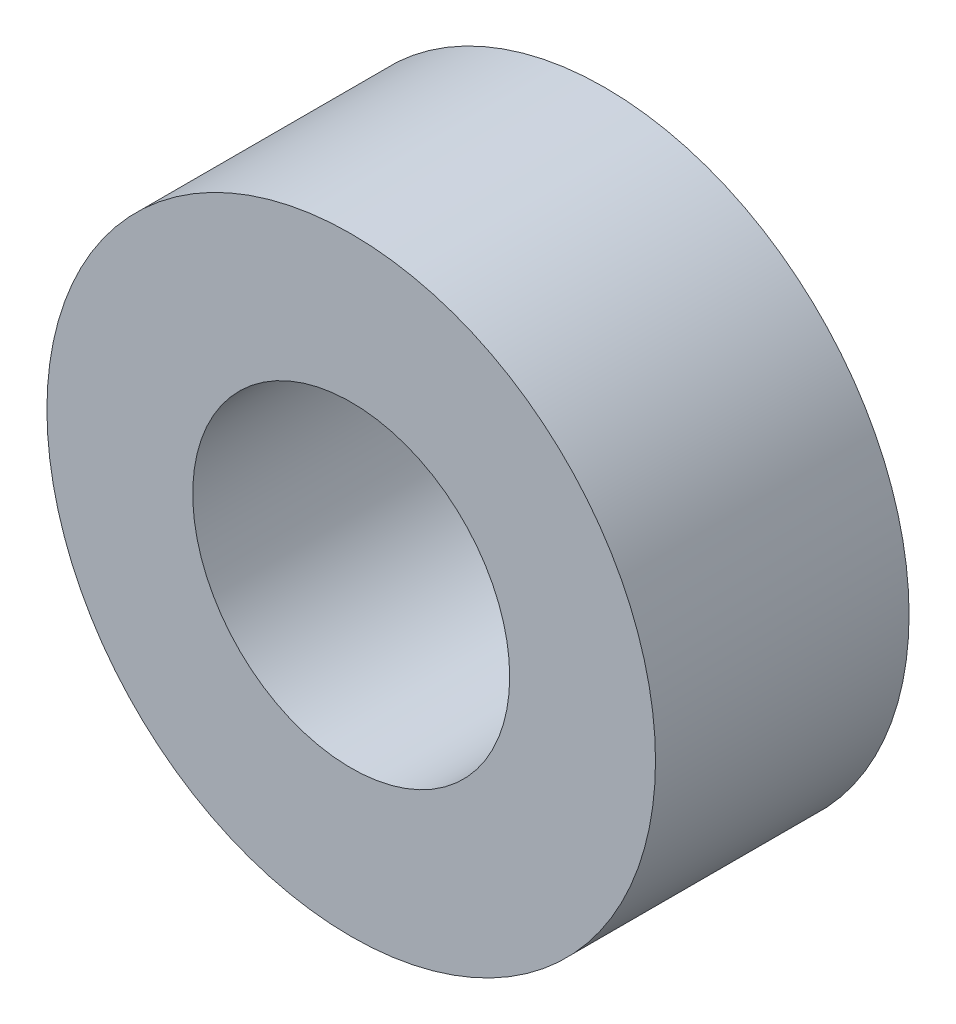
ISO-10303-21;
HEADER;
FILE_DESCRIPTION(('STEP AP214'),'2;1');
FILE_NAME('part.step','',(''),(''),'','','');
FILE_SCHEMA(('AUTOMOTIVE_DESIGN { 1 0 10303 214 1 1 1 1 }'));
ENDSEC;
DATA;
#1=APPLICATION_CONTEXT('core data for automotive mechanical design processes');
#2=APPLICATION_PROTOCOL_DEFINITION('international standard','automotive_design',2000,#1);
#3=PRODUCT_CONTEXT('',#1,'mechanical');
#4=PRODUCT('Part','Part','',(#3));
#5=PRODUCT_RELATED_PRODUCT_CATEGORY('part','',(#4));
#6=PRODUCT_DEFINITION_FORMATION('','',#4);
#7=PRODUCT_DEFINITION_CONTEXT('part definition',#1,'design');
#8=PRODUCT_DEFINITION('design','',#6,#7);
#9=PRODUCT_DEFINITION_SHAPE('','',#8);
#10=(LENGTH_UNIT() NAMED_UNIT(*) SI_UNIT(.MILLI.,.METRE.));
#11=(NAMED_UNIT(*) PLANE_ANGLE_UNIT() SI_UNIT($,.RADIAN.));
#12=(NAMED_UNIT(*) SI_UNIT($,.STERADIAN.) SOLID_ANGLE_UNIT());
#13=UNCERTAINTY_MEASURE_WITH_UNIT(LENGTH_MEASURE(1.E-05),#10,'distance_accuracy_value','');
#14=(GEOMETRIC_REPRESENTATION_CONTEXT(3) GLOBAL_UNCERTAINTY_ASSIGNED_CONTEXT((#13)) GLOBAL_UNIT_ASSIGNED_CONTEXT((#10,
#11,#12)) REPRESENTATION_CONTEXT('',''));
#15=CARTESIAN_POINT('',(0.,0.,0.));
#16=DIRECTION('',(0.,0.,1.));
#17=DIRECTION('',(1.,0.,0.));
#18=AXIS2_PLACEMENT_3D('',#15,#16,#17);
#19=CARTESIAN_POINT('',(0.,0.,2.5));
#20=DIRECTION('',(0.,0.,1.));
#21=DIRECTION('',(1.,0.,0.));
#22=AXIS2_PLACEMENT_3D('',#19,#20,#21);
#23=PLANE('',#22);
#24=CARTESIAN_POINT('',(0.,0.,2.5));
#25=DIRECTION('',(0.,0.,1.));
#26=DIRECTION('',(1.,0.,0.));
#27=AXIS2_PLACEMENT_3D('',#24,#25,#26);
#28=CIRCLE('',#27,6.);
#29=CARTESIAN_POINT('',(6.,0.,2.5));
#30=VERTEX_POINT('',#29);
#31=EDGE_CURVE('E10',#30,#30,#28,.T.);
#32=ORIENTED_EDGE('',*,*,#31,.T.);
#33=EDGE_LOOP('',(#32));
#34=FACE_BOUND('',#33,.T.);
#35=CARTESIAN_POINT('',(0.,0.,2.5));
#36=DIRECTION('',(0.,0.,1.));
#37=DIRECTION('',(1.,0.,0.));
#38=AXIS2_PLACEMENT_3D('',#35,#36,#37);
#39=CIRCLE('',#38,3.125);
#40=CARTESIAN_POINT('',(3.125,0.,2.5));
#41=VERTEX_POINT('',#40);
#42=EDGE_CURVE('E48',#41,#41,#39,.T.);
#43=ORIENTED_EDGE('',*,*,#42,.F.);
#44=EDGE_LOOP('',(#43));
#45=FACE_BOUND('',#44,.T.);
#46=ADVANCED_FACE('F40',(#34,#45),#23,.T.);
#47=CARTESIAN_POINT('',(0.,0.,-2.5));
#48=DIRECTION('',(0.,0.,1.));
#49=DIRECTION('',(1.,0.,0.));
#50=AXIS2_PLACEMENT_3D('',#47,#48,#49);
#51=PLANE('',#50);
#52=CARTESIAN_POINT('',(0.,0.,-2.5));
#53=DIRECTION('',(0.,0.,1.));
#54=DIRECTION('',(1.,0.,0.));
#55=AXIS2_PLACEMENT_3D('',#52,#53,#54);
#56=CIRCLE('',#55,6.);
#57=CARTESIAN_POINT('',(6.,0.,-2.5));
#58=VERTEX_POINT('',#57);
#59=EDGE_CURVE('E41',#58,#58,#56,.T.);
#60=ORIENTED_EDGE('',*,*,#59,.F.);
#61=EDGE_LOOP('',(#60));
#62=FACE_BOUND('',#61,.T.);
#63=CARTESIAN_POINT('',(0.,0.,-2.5));
#64=DIRECTION('',(0.,0.,1.));
#65=DIRECTION('',(1.,0.,0.));
#66=AXIS2_PLACEMENT_3D('',#63,#64,#65);
#67=CIRCLE('',#66,3.125);
#68=CARTESIAN_POINT('',(3.125,0.,-2.5));
#69=VERTEX_POINT('',#68);
#70=EDGE_CURVE('E49',#69,#69,#67,.T.);
#71=ORIENTED_EDGE('',*,*,#70,.T.);
#72=EDGE_LOOP('',(#71));
#73=FACE_BOUND('',#72,.T.);
#74=ADVANCED_FACE('F58',(#62,#73),#51,.F.);
#75=CARTESIAN_POINT('',(0.,0.,2.5));
#76=DIRECTION('',(0.,0.,-1.));
#77=DIRECTION('',(-1.,0.,0.));
#78=AXIS2_PLACEMENT_3D('',#75,#76,#77);
#79=CYLINDRICAL_SURFACE('',#78,6.);
#80=ORIENTED_EDGE('',*,*,#31,.F.);
#81=EDGE_LOOP('',(#80));
#82=FACE_BOUND('',#81,.T.);
#83=ORIENTED_EDGE('',*,*,#59,.T.);
#84=EDGE_LOOP('',(#83));
#85=FACE_BOUND('',#84,.T.);
#86=ADVANCED_FACE('F39',(#82,#85),#79,.T.);
#87=CARTESIAN_POINT('',(0.,0.,2.5));
#88=DIRECTION('',(0.,0.,-1.));
#89=DIRECTION('',(-1.,0.,0.));
#90=AXIS2_PLACEMENT_3D('',#87,#88,#89);
#91=CYLINDRICAL_SURFACE('',#90,3.125);
#92=ORIENTED_EDGE('',*,*,#42,.T.);
#93=EDGE_LOOP('',(#92));
#94=FACE_BOUND('',#93,.T.);
#95=ORIENTED_EDGE('',*,*,#70,.F.);
#96=EDGE_LOOP('',(#95));
#97=FACE_BOUND('',#96,.T.);
#98=ADVANCED_FACE('F57',(#94,#97),#91,.F.);
#99=CLOSED_SHELL('',(#46,#74,#86,#98));
#100=MANIFOLD_SOLID_BREP('B2',#99);
#101=ADVANCED_BREP_SHAPE_REPRESENTATION('',(#18,#100),#14);
#102=SHAPE_DEFINITION_REPRESENTATION(#9,#101);
ENDSEC;
END-ISO-10303-21;
